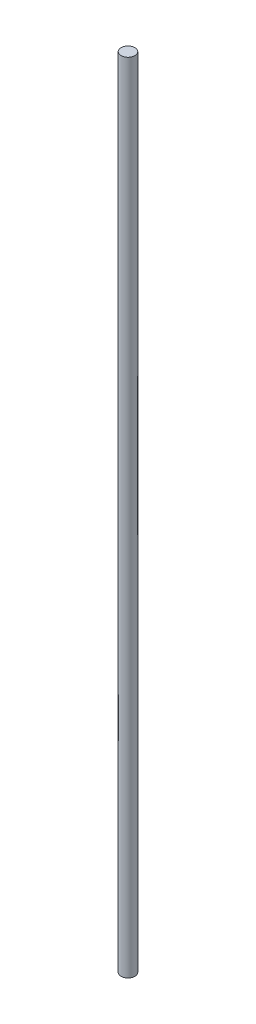
ISO-10303-21;
HEADER;
FILE_DESCRIPTION(('STEP AP214'),'2;1');
FILE_NAME('part.step','',(''),(''),'','','');
FILE_SCHEMA(('AUTOMOTIVE_DESIGN { 1 0 10303 214 1 1 1 1 }'));
ENDSEC;
DATA;
#1=APPLICATION_CONTEXT('core data for automotive mechanical design processes');
#2=APPLICATION_PROTOCOL_DEFINITION('international standard','automotive_design',2000,#1);
#3=PRODUCT_CONTEXT('',#1,'mechanical');
#4=PRODUCT('Part','Part','',(#3));
#5=PRODUCT_RELATED_PRODUCT_CATEGORY('part','',(#4));
#6=PRODUCT_DEFINITION_FORMATION('','',#4);
#7=PRODUCT_DEFINITION_CONTEXT('part definition',#1,'design');
#8=PRODUCT_DEFINITION('design','',#6,#7);
#9=PRODUCT_DEFINITION_SHAPE('','',#8);
#10=(LENGTH_UNIT() NAMED_UNIT(*) SI_UNIT(.MILLI.,.METRE.));
#11=(NAMED_UNIT(*) PLANE_ANGLE_UNIT() SI_UNIT($,.RADIAN.));
#12=(NAMED_UNIT(*) SI_UNIT($,.STERADIAN.) SOLID_ANGLE_UNIT());
#13=UNCERTAINTY_MEASURE_WITH_UNIT(LENGTH_MEASURE(1.E-05),#10,'distance_accuracy_value','');
#14=(GEOMETRIC_REPRESENTATION_CONTEXT(3) GLOBAL_UNCERTAINTY_ASSIGNED_CONTEXT((#13)) GLOBAL_UNIT_ASSIGNED_CONTEXT((#10,
#11,#12)) REPRESENTATION_CONTEXT('',''));
#15=CARTESIAN_POINT('',(0.,0.,0.));
#16=DIRECTION('',(0.,0.,1.));
#17=DIRECTION('',(1.,0.,0.));
#18=AXIS2_PLACEMENT_3D('',#15,#16,#17);
#19=CARTESIAN_POINT('',(0.,457.2,0.));
#20=DIRECTION('',(0.,-1.,0.));
#21=DIRECTION('',(0.,0.,-1.));
#22=AXIS2_PLACEMENT_3D('',#19,#20,#21);
#23=CYLINDRICAL_SURFACE('',#22,3.96875);
#24=CARTESIAN_POINT('',(0.,457.2,0.));
#25=DIRECTION('',(0.,1.,0.));
#26=DIRECTION('',(0.,0.,1.));
#27=AXIS2_PLACEMENT_3D('',#24,#25,#26);
#28=CIRCLE('',#27,3.96875);
#29=CARTESIAN_POINT('',(0.,457.2,3.96875));
#30=VERTEX_POINT('',#29);
#31=EDGE_CURVE('E10',#30,#30,#28,.T.);
#32=ORIENTED_EDGE('',*,*,#31,.F.);
#33=EDGE_LOOP('',(#32));
#34=FACE_BOUND('',#33,.T.);
#35=CARTESIAN_POINT('',(0.,0.,0.));
#36=DIRECTION('',(0.,1.,0.));
#37=DIRECTION('',(0.,0.,1.));
#38=AXIS2_PLACEMENT_3D('',#35,#36,#37);
#39=CIRCLE('',#38,3.96875);
#40=CARTESIAN_POINT('',(0.,0.,3.96875));
#41=VERTEX_POINT('',#40);
#42=EDGE_CURVE('E39',#41,#41,#39,.T.);
#43=ORIENTED_EDGE('',*,*,#42,.T.);
#44=EDGE_LOOP('',(#43));
#45=FACE_BOUND('',#44,.T.);
#46=ADVANCED_FACE('F36',(#34,#45),#23,.T.);
#47=CARTESIAN_POINT('',(0.,457.2,0.));
#48=DIRECTION('',(0.,1.,0.));
#49=DIRECTION('',(0.,0.,1.));
#50=AXIS2_PLACEMENT_3D('',#47,#48,#49);
#51=PLANE('',#50);
#52=ORIENTED_EDGE('',*,*,#31,.T.);
#53=EDGE_LOOP('',(#52));
#54=FACE_BOUND('',#53,.T.);
#55=ADVANCED_FACE('F51',(#54),#51,.T.);
#56=CARTESIAN_POINT('',(0.,0.,0.));
#57=DIRECTION('',(0.,1.,0.));
#58=DIRECTION('',(0.,0.,1.));
#59=AXIS2_PLACEMENT_3D('',#56,#57,#58);
#60=PLANE('',#59);
#61=ORIENTED_EDGE('',*,*,#42,.F.);
#62=EDGE_LOOP('',(#61));
#63=FACE_BOUND('',#62,.T.);
#64=ADVANCED_FACE('F49',(#63),#60,.F.);
#65=CLOSED_SHELL('',(#46,#55,#64));
#66=MANIFOLD_SOLID_BREP('B2',#65);
#67=ADVANCED_BREP_SHAPE_REPRESENTATION('',(#18,#66),#14);
#68=SHAPE_DEFINITION_REPRESENTATION(#9,#67);
ENDSEC;
END-ISO-10303-21;
